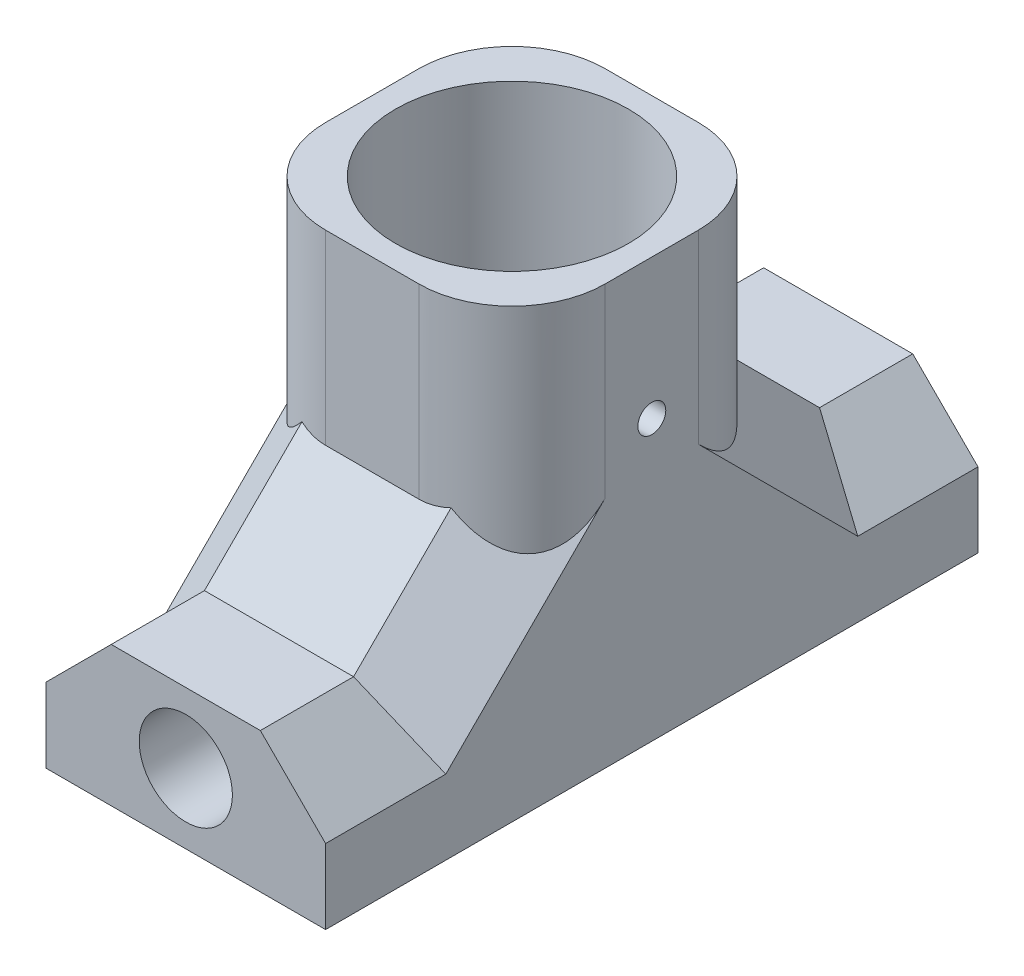
ISO-10303-21;
HEADER;
FILE_DESCRIPTION(('STEP AP214'),'2;1');
FILE_NAME('part.step','',(''),(''),'','','');
FILE_SCHEMA(('AUTOMOTIVE_DESIGN { 1 0 10303 214 1 1 1 1 }'));
ENDSEC;
DATA;
#1=APPLICATION_CONTEXT('core data for automotive mechanical design processes');
#2=APPLICATION_PROTOCOL_DEFINITION('international standard','automotive_design',2000,#1);
#3=PRODUCT_CONTEXT('',#1,'mechanical');
#4=PRODUCT('Part','Part','',(#3));
#5=PRODUCT_RELATED_PRODUCT_CATEGORY('part','',(#4));
#6=PRODUCT_DEFINITION_FORMATION('','',#4);
#7=PRODUCT_DEFINITION_CONTEXT('part definition',#1,'design');
#8=PRODUCT_DEFINITION('design','',#6,#7);
#9=PRODUCT_DEFINITION_SHAPE('','',#8);
#10=(LENGTH_UNIT() NAMED_UNIT(*) SI_UNIT(.MILLI.,.METRE.));
#11=(NAMED_UNIT(*) PLANE_ANGLE_UNIT() SI_UNIT($,.RADIAN.));
#12=(NAMED_UNIT(*) SI_UNIT($,.STERADIAN.) SOLID_ANGLE_UNIT());
#13=UNCERTAINTY_MEASURE_WITH_UNIT(LENGTH_MEASURE(1.E-05),#10,'distance_accuracy_value','');
#14=(GEOMETRIC_REPRESENTATION_CONTEXT(3) GLOBAL_UNCERTAINTY_ASSIGNED_CONTEXT((#13)) GLOBAL_UNIT_ASSIGNED_CONTEXT((#10,
#11,#12)) REPRESENTATION_CONTEXT('',''));
#15=CARTESIAN_POINT('',(0.,0.,0.));
#16=DIRECTION('',(0.,0.,1.));
#17=DIRECTION('',(1.,0.,0.));
#18=AXIS2_PLACEMENT_3D('',#15,#16,#17);
#19=CARTESIAN_POINT('',(30.,0.,0.));
#20=DIRECTION('',(0.,0.,-1.));
#21=DIRECTION('',(-1.,0.,0.));
#22=AXIS2_PLACEMENT_3D('',#19,#20,#21);
#23=PLANE('',#22);
#24=CARTESIAN_POINT('',(15.,7.5,0.));
#25=DIRECTION('',(0.,0.,1.));
#26=DIRECTION('',(1.,0.,0.));
#27=AXIS2_PLACEMENT_3D('',#24,#25,#26);
#28=CIRCLE('',#27,5.);
#29=CARTESIAN_POINT('',(20.,7.5,0.));
#30=VERTEX_POINT('',#29);
#31=EDGE_CURVE('E363',#30,#30,#28,.T.);
#32=ORIENTED_EDGE('',*,*,#31,.F.);
#33=EDGE_LOOP('',(#32));
#34=FACE_BOUND('',#33,.T.);
#35=DIRECTION('',(-1.,0.,0.));
#36=VECTOR('',#35,1.);
#37=CARTESIAN_POINT('',(30.,15.,0.));
#38=LINE('',#37,#36);
#39=CARTESIAN_POINT('',(23.,15.,0.));
#40=VERTEX_POINT('',#39);
#41=CARTESIAN_POINT('',(7.00000000000002,15.,0.));
#42=VERTEX_POINT('',#41);
#43=EDGE_CURVE('E493',#40,#42,#38,.T.);
#44=ORIENTED_EDGE('',*,*,#43,.T.);
#45=DIRECTION('',(-0.707106781186549,-0.707106781186546,0.));
#46=VECTOR('',#45,1.);
#47=CARTESIAN_POINT('',(7.00000000000002,15.,0.));
#48=LINE('',#47,#46);
#49=CARTESIAN_POINT('',(0.,8.,0.));
#50=VERTEX_POINT('',#49);
#51=EDGE_CURVE('E297',#42,#50,#48,.T.);
#52=ORIENTED_EDGE('',*,*,#51,.T.);
#53=DIRECTION('',(0.,-1.,0.));
#54=VECTOR('',#53,1.);
#55=CARTESIAN_POINT('',(0.,0.,0.));
#56=LINE('',#55,#54);
#57=CARTESIAN_POINT('',(0.,0.,0.));
#58=VERTEX_POINT('',#57);
#59=EDGE_CURVE('E211',#50,#58,#56,.T.);
#60=ORIENTED_EDGE('',*,*,#59,.T.);
#61=DIRECTION('',(-1.,0.,0.));
#62=VECTOR('',#61,1.);
#63=CARTESIAN_POINT('',(30.,0.,0.));
#64=LINE('',#63,#62);
#65=CARTESIAN_POINT('',(30.,0.,0.));
#66=VERTEX_POINT('',#65);
#67=EDGE_CURVE('E202',#66,#58,#64,.T.);
#68=ORIENTED_EDGE('',*,*,#67,.F.);
#69=DIRECTION('',(0.,-1.,0.));
#70=VECTOR('',#69,1.);
#71=CARTESIAN_POINT('',(30.,0.,0.));
#72=LINE('',#71,#70);
#73=CARTESIAN_POINT('',(30.,8.00000000000001,0.));
#74=VERTEX_POINT('',#73);
#75=EDGE_CURVE('E186',#74,#66,#72,.T.);
#76=ORIENTED_EDGE('',*,*,#75,.F.);
#77=DIRECTION('',(0.707106781186549,-0.707106781186546,0.));
#78=VECTOR('',#77,1.);
#79=CARTESIAN_POINT('',(30.,8.00000000000001,0.));
#80=LINE('',#79,#78);
#81=EDGE_CURVE('E294',#74,#40,#80,.F.);
#82=ORIENTED_EDGE('',*,*,#81,.T.);
#83=EDGE_LOOP('',(#44,#52,#60,#68,#76,#82));
#84=FACE_BOUND('',#83,.T.);
#85=ADVANCED_FACE('F39',(#34,#84),#23,.F.);
#86=CARTESIAN_POINT('',(30.,0.,0.));
#87=DIRECTION('',(0.,1.,0.));
#88=DIRECTION('',(0.,0.,1.));
#89=AXIS2_PLACEMENT_3D('',#86,#87,#88);
#90=PLANE('',#89);
#91=DIRECTION('',(0.,0.,-1.));
#92=VECTOR('',#91,1.);
#93=CARTESIAN_POINT('',(0.,0.,0.));
#94=LINE('',#93,#92);
#95=CARTESIAN_POINT('',(0.,0.,-70.));
#96=VERTEX_POINT('',#95);
#97=EDGE_CURVE('E536',#58,#96,#94,.T.);
#98=ORIENTED_EDGE('',*,*,#97,.T.);
#99=DIRECTION('',(-1.,0.,0.));
#100=VECTOR('',#99,1.);
#101=CARTESIAN_POINT('',(30.,0.,-70.));
#102=LINE('',#101,#100);
#103=CARTESIAN_POINT('',(30.,0.,-70.));
#104=VERTEX_POINT('',#103);
#105=EDGE_CURVE('E204',#104,#96,#102,.T.);
#106=ORIENTED_EDGE('',*,*,#105,.F.);
#107=DIRECTION('',(0.,0.,-1.));
#108=VECTOR('',#107,1.);
#109=CARTESIAN_POINT('',(30.,0.,0.));
#110=LINE('',#109,#108);
#111=EDGE_CURVE('E190',#66,#104,#110,.T.);
#112=ORIENTED_EDGE('',*,*,#111,.F.);
#113=ORIENTED_EDGE('',*,*,#67,.T.);
#114=EDGE_LOOP('',(#98,#106,#112,#113));
#115=FACE_BOUND('',#114,.T.);
#116=ADVANCED_FACE('F201',(#115),#90,.F.);
#117=CARTESIAN_POINT('',(30.,0.,-70.));
#118=DIRECTION('',(0.,0.,1.));
#119=DIRECTION('',(1.,0.,0.));
#120=AXIS2_PLACEMENT_3D('',#117,#118,#119);
#121=PLANE('',#120);
#122=CARTESIAN_POINT('',(15.,7.5,-70.));
#123=DIRECTION('',(0.,0.,1.));
#124=DIRECTION('',(1.,0.,0.));
#125=AXIS2_PLACEMENT_3D('',#122,#123,#124);
#126=CIRCLE('',#125,5.);
#127=CARTESIAN_POINT('',(20.,7.5,-70.));
#128=VERTEX_POINT('',#127);
#129=EDGE_CURVE('E579',#128,#128,#126,.T.);
#130=ORIENTED_EDGE('',*,*,#129,.T.);
#131=EDGE_LOOP('',(#130));
#132=FACE_BOUND('',#131,.T.);
#133=DIRECTION('',(0.,1.,0.));
#134=VECTOR('',#133,1.);
#135=CARTESIAN_POINT('',(0.,0.,-70.));
#136=LINE('',#135,#134);
#137=CARTESIAN_POINT('',(0.,7.99999999999999,-70.));
#138=VERTEX_POINT('',#137);
#139=EDGE_CURVE('E540',#96,#138,#136,.T.);
#140=ORIENTED_EDGE('',*,*,#139,.T.);
#141=DIRECTION('',(0.707106781186549,0.707106781186546,0.));
#142=VECTOR('',#141,1.);
#143=CARTESIAN_POINT('',(7.00000000000005,15.,-70.));
#144=LINE('',#143,#142);
#145=CARTESIAN_POINT('',(7.00000000000005,15.,-70.));
#146=VERTEX_POINT('',#145);
#147=EDGE_CURVE('E329',#138,#146,#144,.T.);
#148=ORIENTED_EDGE('',*,*,#147,.T.);
#149=DIRECTION('',(-1.,0.,0.));
#150=VECTOR('',#149,1.);
#151=CARTESIAN_POINT('',(30.,15.,-70.));
#152=LINE('',#151,#150);
#153=CARTESIAN_POINT('',(22.9999999999999,15.,-70.));
#154=VERTEX_POINT('',#153);
#155=EDGE_CURVE('E221',#154,#146,#152,.T.);
#156=ORIENTED_EDGE('',*,*,#155,.F.);
#157=DIRECTION('',(-0.707106781186549,0.707106781186546,0.));
#158=VECTOR('',#157,1.);
#159=CARTESIAN_POINT('',(30.,7.99999999999997,-70.));
#160=LINE('',#159,#158);
#161=CARTESIAN_POINT('',(30.,7.99999999999997,-70.));
#162=VERTEX_POINT('',#161);
#163=EDGE_CURVE('E326',#154,#162,#160,.F.);
#164=ORIENTED_EDGE('',*,*,#163,.T.);
#165=DIRECTION('',(0.,1.,0.));
#166=VECTOR('',#165,1.);
#167=CARTESIAN_POINT('',(30.,0.,-70.));
#168=LINE('',#167,#166);
#169=EDGE_CURVE('E207',#104,#162,#168,.T.);
#170=ORIENTED_EDGE('',*,*,#169,.F.);
#171=ORIENTED_EDGE('',*,*,#105,.T.);
#172=EDGE_LOOP('',(#140,#148,#156,#164,#170,#171));
#173=FACE_BOUND('',#172,.T.);
#174=ADVANCED_FACE('F409',(#132,#173),#121,.F.);
#175=CARTESIAN_POINT('',(30.,15.,-50.));
#176=DIRECTION('',(0.,-1.,0.));
#177=DIRECTION('',(0.,0.,-1.));
#178=AXIS2_PLACEMENT_3D('',#175,#176,#177);
#179=PLANE('',#178);
#180=ORIENTED_EDGE('',*,*,#155,.T.);
#181=DIRECTION('',(0.,0.,1.));
#182=VECTOR('',#181,1.);
#183=CARTESIAN_POINT('',(7.00000000000005,15.,-60.));
#184=LINE('',#183,#182);
#185=CARTESIAN_POINT('',(7.00000000000005,15.,-60.));
#186=VERTEX_POINT('',#185);
#187=EDGE_CURVE('E322',#146,#186,#184,.T.);
#188=ORIENTED_EDGE('',*,*,#187,.T.);
#189=DIRECTION('',(1.,0.,0.));
#190=VECTOR('',#189,1.);
#191=CARTESIAN_POINT('',(30.,15.,-60.));
#192=LINE('',#191,#190);
#193=CARTESIAN_POINT('',(22.9999999999999,15.,-60.));
#194=VERTEX_POINT('',#193);
#195=EDGE_CURVE('E219',#186,#194,#192,.T.);
#196=ORIENTED_EDGE('',*,*,#195,.T.);
#197=DIRECTION('',(0.,0.,-1.));
#198=VECTOR('',#197,1.);
#199=CARTESIAN_POINT('',(22.9999999999999,15.,-50.));
#200=LINE('',#199,#198);
#201=EDGE_CURVE('E319',#194,#154,#200,.T.);
#202=ORIENTED_EDGE('',*,*,#201,.T.);
#203=EDGE_LOOP('',(#180,#188,#196,#202));
#204=FACE_BOUND('',#203,.T.);
#205=ADVANCED_FACE('F506',(#204),#179,.F.);
#206=CARTESIAN_POINT('',(30.,15.,-50.));
#207=DIRECTION('',(0.,0.,1.));
#208=DIRECTION('',(0.,-1.,0.));
#209=AXIS2_PLACEMENT_3D('',#206,#207,#208);
#210=PLANE('',#209);
#211=DIRECTION('',(-1.,0.,0.));
#212=VECTOR('',#211,1.);
#213=CARTESIAN_POINT('',(0.,25.0000000000001,-50.));
#214=LINE('',#213,#212);
#215=CARTESIAN_POINT('',(20.,25.0000000000001,-50.));
#216=VERTEX_POINT('',#215);
#217=CARTESIAN_POINT('',(10.,25.0000000000001,-50.));
#218=VERTEX_POINT('',#217);
#219=EDGE_CURVE('E214',#216,#218,#214,.T.);
#220=ORIENTED_EDGE('',*,*,#219,.T.);
#221=DIRECTION('',(0.,1.,0.));
#222=VECTOR('',#221,1.);
#223=CARTESIAN_POINT('',(10.,45.,-50.));
#224=LINE('',#223,#222);
#225=CARTESIAN_POINT('',(10.,45.,-50.));
#226=VERTEX_POINT('',#225);
#227=EDGE_CURVE('E239',#218,#226,#224,.T.);
#228=ORIENTED_EDGE('',*,*,#227,.T.);
#229=DIRECTION('',(-1.,0.,0.));
#230=VECTOR('',#229,1.);
#231=CARTESIAN_POINT('',(30.,45.,-50.));
#232=LINE('',#231,#230);
#233=CARTESIAN_POINT('',(20.,45.,-50.));
#234=VERTEX_POINT('',#233);
#235=EDGE_CURVE('E492',#234,#226,#232,.T.);
#236=ORIENTED_EDGE('',*,*,#235,.F.);
#237=DIRECTION('',(0.,1.,0.));
#238=VECTOR('',#237,1.);
#239=CARTESIAN_POINT('',(20.,15.,-50.));
#240=LINE('',#239,#238);
#241=EDGE_CURVE('E236',#234,#216,#240,.F.);
#242=ORIENTED_EDGE('',*,*,#241,.T.);
#243=EDGE_LOOP('',(#220,#228,#236,#242));
#244=FACE_BOUND('',#243,.T.);
#245=ADVANCED_FACE('F522',(#244),#210,.F.);
#246=CARTESIAN_POINT('',(30.,45.,-20.));
#247=DIRECTION('',(0.,-1.,0.));
#248=DIRECTION('',(0.,0.,-1.));
#249=AXIS2_PLACEMENT_3D('',#246,#247,#248);
#250=PLANE('',#249);
#251=CARTESIAN_POINT('',(15.,45.,-35.));
#252=DIRECTION('',(0.,1.,0.));
#253=DIRECTION('',(0.,0.,1.));
#254=AXIS2_PLACEMENT_3D('',#251,#252,#253);
#255=CIRCLE('',#254,12.5);
#256=CARTESIAN_POINT('',(15.,45.,-22.5));
#257=VERTEX_POINT('',#256);
#258=EDGE_CURVE('E581',#257,#257,#255,.T.);
#259=ORIENTED_EDGE('',*,*,#258,.F.);
#260=EDGE_LOOP('',(#259));
#261=FACE_BOUND('',#260,.T.);
#262=ORIENTED_EDGE('',*,*,#235,.T.);
#263=CARTESIAN_POINT('',(10.,45.,-40.));
#264=DIRECTION('',(0.,-1.,0.));
#265=DIRECTION('',(0.,0.,-1.));
#266=AXIS2_PLACEMENT_3D('',#263,#264,#265);
#267=CIRCLE('',#266,10.);
#268=CARTESIAN_POINT('',(0.,45.,-40.));
#269=VERTEX_POINT('',#268);
#270=EDGE_CURVE('E252',#226,#269,#267,.F.);
#271=ORIENTED_EDGE('',*,*,#270,.T.);
#272=DIRECTION('',(0.,0.,1.));
#273=VECTOR('',#272,1.);
#274=CARTESIAN_POINT('',(0.,45.,-20.));
#275=LINE('',#274,#273);
#276=CARTESIAN_POINT('',(0.,45.,-30.));
#277=VERTEX_POINT('',#276);
#278=EDGE_CURVE('E197',#269,#277,#275,.T.);
#279=ORIENTED_EDGE('',*,*,#278,.T.);
#280=CARTESIAN_POINT('',(10.,45.,-30.));
#281=DIRECTION('',(0.,-1.,0.));
#282=DIRECTION('',(0.,0.,-1.));
#283=AXIS2_PLACEMENT_3D('',#280,#281,#282);
#284=CIRCLE('',#283,10.);
#285=CARTESIAN_POINT('',(10.,45.,-20.));
#286=VERTEX_POINT('',#285);
#287=EDGE_CURVE('E246',#277,#286,#284,.F.);
#288=ORIENTED_EDGE('',*,*,#287,.T.);
#289=DIRECTION('',(-1.,0.,0.));
#290=VECTOR('',#289,1.);
#291=CARTESIAN_POINT('',(30.,45.,-20.));
#292=LINE('',#291,#290);
#293=CARTESIAN_POINT('',(20.,45.,-20.));
#294=VERTEX_POINT('',#293);
#295=EDGE_CURVE('E482',#294,#286,#292,.T.);
#296=ORIENTED_EDGE('',*,*,#295,.F.);
#297=CARTESIAN_POINT('',(20.,45.,-30.));
#298=DIRECTION('',(0.,-1.,0.));
#299=DIRECTION('',(0.,0.,-1.));
#300=AXIS2_PLACEMENT_3D('',#297,#298,#299);
#301=CIRCLE('',#300,10.);
#302=CARTESIAN_POINT('',(30.,45.,-30.));
#303=VERTEX_POINT('',#302);
#304=EDGE_CURVE('E243',#294,#303,#301,.F.);
#305=ORIENTED_EDGE('',*,*,#304,.T.);
#306=DIRECTION('',(0.,0.,1.));
#307=VECTOR('',#306,1.);
#308=CARTESIAN_POINT('',(30.,45.,-20.));
#309=LINE('',#308,#307);
#310=CARTESIAN_POINT('',(30.,45.,-40.));
#311=VERTEX_POINT('',#310);
#312=EDGE_CURVE('E498',#311,#303,#309,.T.);
#313=ORIENTED_EDGE('',*,*,#312,.F.);
#314=CARTESIAN_POINT('',(20.,45.,-40.));
#315=DIRECTION('',(0.,-1.,0.));
#316=DIRECTION('',(0.,0.,-1.));
#317=AXIS2_PLACEMENT_3D('',#314,#315,#316);
#318=CIRCLE('',#317,10.);
#319=EDGE_CURVE('E249',#311,#234,#318,.F.);
#320=ORIENTED_EDGE('',*,*,#319,.T.);
#321=EDGE_LOOP('',(#262,#271,#279,#288,#296,#305,#313,#320));
#322=FACE_BOUND('',#321,.T.);
#323=ADVANCED_FACE('F486',(#261,#322),#250,.F.);
#324=CARTESIAN_POINT('',(30.,15.,-20.));
#325=DIRECTION('',(0.,0.,-1.));
#326=DIRECTION('',(-1.,0.,0.));
#327=AXIS2_PLACEMENT_3D('',#324,#325,#326);
#328=PLANE('',#327);
#329=ORIENTED_EDGE('',*,*,#295,.T.);
#330=DIRECTION('',(0.,-1.,0.));
#331=VECTOR('',#330,1.);
#332=CARTESIAN_POINT('',(10.,25.,-20.));
#333=LINE('',#332,#331);
#334=CARTESIAN_POINT('',(10.,25.,-20.));
#335=VERTEX_POINT('',#334);
#336=EDGE_CURVE('E269',#286,#335,#333,.T.);
#337=ORIENTED_EDGE('',*,*,#336,.T.);
#338=DIRECTION('',(1.,0.,0.));
#339=VECTOR('',#338,1.);
#340=CARTESIAN_POINT('',(30.,25.,-20.));
#341=LINE('',#340,#339);
#342=CARTESIAN_POINT('',(20.,25.,-20.));
#343=VERTEX_POINT('',#342);
#344=EDGE_CURVE('E232',#335,#343,#341,.T.);
#345=ORIENTED_EDGE('',*,*,#344,.T.);
#346=DIRECTION('',(0.,-1.,0.));
#347=VECTOR('',#346,1.);
#348=CARTESIAN_POINT('',(20.,15.,-20.));
#349=LINE('',#348,#347);
#350=EDGE_CURVE('E266',#343,#294,#349,.F.);
#351=ORIENTED_EDGE('',*,*,#350,.T.);
#352=EDGE_LOOP('',(#329,#337,#345,#351));
#353=FACE_BOUND('',#352,.T.);
#354=ADVANCED_FACE('F481',(#353),#328,.F.);
#355=CARTESIAN_POINT('',(30.,15.,0.));
#356=DIRECTION('',(0.,-1.,0.));
#357=DIRECTION('',(0.,0.,-1.));
#358=AXIS2_PLACEMENT_3D('',#355,#356,#357);
#359=PLANE('',#358);
#360=DIRECTION('',(-1.,0.,0.));
#361=VECTOR('',#360,1.);
#362=CARTESIAN_POINT('',(0.,15.,-9.99999999999993));
#363=LINE('',#362,#361);
#364=CARTESIAN_POINT('',(23.,15.,-9.99999999999993));
#365=VERTEX_POINT('',#364);
#366=CARTESIAN_POINT('',(7.00000000000002,15.,-9.99999999999993));
#367=VERTEX_POINT('',#366);
#368=EDGE_CURVE('E228',#365,#367,#363,.T.);
#369=ORIENTED_EDGE('',*,*,#368,.T.);
#370=DIRECTION('',(0.,0.,1.));
#371=VECTOR('',#370,1.);
#372=CARTESIAN_POINT('',(7.00000000000002,15.,0.));
#373=LINE('',#372,#371);
#374=EDGE_CURVE('E290',#367,#42,#373,.T.);
#375=ORIENTED_EDGE('',*,*,#374,.T.);
#376=ORIENTED_EDGE('',*,*,#43,.F.);
#377=DIRECTION('',(0.,0.,-1.));
#378=VECTOR('',#377,1.);
#379=CARTESIAN_POINT('',(23.,15.,0.));
#380=LINE('',#379,#378);
#381=EDGE_CURVE('E287',#40,#365,#380,.T.);
#382=ORIENTED_EDGE('',*,*,#381,.T.);
#383=EDGE_LOOP('',(#369,#375,#376,#382));
#384=FACE_BOUND('',#383,.T.);
#385=ADVANCED_FACE('F552',(#384),#359,.F.);
#386=CARTESIAN_POINT('',(30.,0.,0.));
#387=DIRECTION('',(-1.,0.,0.));
#388=DIRECTION('',(0.,0.,1.));
#389=AXIS2_PLACEMENT_3D('',#386,#387,#388);
#390=PLANE('',#389);
#391=CARTESIAN_POINT('',(30.,30.,-35.));
#392=DIRECTION('',(1.,0.,0.));
#393=DIRECTION('',(0.,0.,-1.));
#394=AXIS2_PLACEMENT_3D('',#391,#392,#393);
#395=CIRCLE('',#394,1.5);
#396=CARTESIAN_POINT('',(30.,30.,-36.5));
#397=VERTEX_POINT('',#396);
#398=EDGE_CURVE('E590',#397,#397,#395,.T.);
#399=ORIENTED_EDGE('',*,*,#398,.F.);
#400=EDGE_LOOP('',(#399));
#401=FACE_BOUND('',#400,.T.);
#402=ORIENTED_EDGE('',*,*,#169,.T.);
#403=DIRECTION('',(0.,0.,1.));
#404=VECTOR('',#403,1.);
#405=CARTESIAN_POINT('',(30.,7.99999999999997,0.));
#406=LINE('',#405,#404);
#407=CARTESIAN_POINT('',(30.,7.99999999999997,-57.1005050633882));
#408=VERTEX_POINT('',#407);
#409=EDGE_CURVE('E346',#162,#408,#406,.T.);
#410=ORIENTED_EDGE('',*,*,#409,.T.);
#411=DIRECTION('',(0.,0.707106781186551,0.707106781186544));
#412=VECTOR('',#411,1.);
#413=CARTESIAN_POINT('',(30.,32.5502525316941,-32.5502525316944));
#414=LINE('',#413,#412);
#415=CARTESIAN_POINT('',(30.,25.1005050633884,-40.));
#416=VERTEX_POINT('',#415);
#417=EDGE_CURVE('E343',#408,#416,#414,.T.);
#418=ORIENTED_EDGE('',*,*,#417,.T.);
#419=DIRECTION('',(0.,1.,0.));
#420=VECTOR('',#419,1.);
#421=CARTESIAN_POINT('',(30.,0.,-40.));
#422=LINE('',#421,#420);
#423=EDGE_CURVE('E70',#416,#311,#422,.T.);
#424=ORIENTED_EDGE('',*,*,#423,.T.);
#425=ORIENTED_EDGE('',*,*,#312,.T.);
#426=DIRECTION('',(0.,-1.,0.));
#427=VECTOR('',#426,1.);
#428=CARTESIAN_POINT('',(30.,0.,-30.));
#429=LINE('',#428,#427);
#430=CARTESIAN_POINT('',(30.,25.1005050633883,-30.));
#431=VERTEX_POINT('',#430);
#432=EDGE_CURVE('E261',#303,#431,#429,.T.);
#433=ORIENTED_EDGE('',*,*,#432,.T.);
#434=DIRECTION('',(0.,-0.707106781186544,0.707106781186551));
#435=VECTOR('',#434,1.);
#436=CARTESIAN_POINT('',(30.,-2.44974746830574,-2.44974746830572));
#437=LINE('',#436,#435);
#438=CARTESIAN_POINT('',(30.,8.00000000000001,-12.8994949366116));
#439=VERTEX_POINT('',#438);
#440=EDGE_CURVE('E338',#431,#439,#437,.T.);
#441=ORIENTED_EDGE('',*,*,#440,.T.);
#442=DIRECTION('',(0.,0.,1.));
#443=VECTOR('',#442,1.);
#444=CARTESIAN_POINT('',(30.,8.00000000000001,0.));
#445=LINE('',#444,#443);
#446=EDGE_CURVE('E193',#439,#74,#445,.T.);
#447=ORIENTED_EDGE('',*,*,#446,.T.);
#448=ORIENTED_EDGE('',*,*,#75,.T.);
#449=ORIENTED_EDGE('',*,*,#111,.T.);
#450=EDGE_LOOP('',(#402,#410,#418,#424,#425,#433,#441,#447,#448,#449));
#451=FACE_BOUND('',#450,.T.);
#452=ADVANCED_FACE('F189',(#401,#451),#390,.F.);
#453=CARTESIAN_POINT('',(0.,0.,0.));
#454=DIRECTION('',(-1.,0.,0.));
#455=DIRECTION('',(0.,0.,1.));
#456=AXIS2_PLACEMENT_3D('',#453,#454,#455);
#457=PLANE('',#456);
#458=CARTESIAN_POINT('',(0.,30.,-35.));
#459=DIRECTION('',(1.,0.,0.));
#460=DIRECTION('',(0.,0.,-1.));
#461=AXIS2_PLACEMENT_3D('',#458,#459,#460);
#462=CIRCLE('',#461,1.5);
#463=CARTESIAN_POINT('',(0.,30.,-36.5));
#464=VERTEX_POINT('',#463);
#465=EDGE_CURVE('E378',#464,#464,#462,.T.);
#466=ORIENTED_EDGE('',*,*,#465,.T.);
#467=EDGE_LOOP('',(#466));
#468=FACE_BOUND('',#467,.T.);
#469=ORIENTED_EDGE('',*,*,#59,.F.);
#470=DIRECTION('',(0.,0.,-1.));
#471=VECTOR('',#470,1.);
#472=CARTESIAN_POINT('',(0.,8.,-9.99999999999993));
#473=LINE('',#472,#471);
#474=CARTESIAN_POINT('',(0.,8.,-12.8994949366116));
#475=VERTEX_POINT('',#474);
#476=EDGE_CURVE('E310',#50,#475,#473,.T.);
#477=ORIENTED_EDGE('',*,*,#476,.T.);
#478=DIRECTION('',(0.,0.707106781186544,-0.707106781186551));
#479=VECTOR('',#478,1.);
#480=CARTESIAN_POINT('',(0.,30.050252531694,-34.9497474683058));
#481=LINE('',#480,#479);
#482=CARTESIAN_POINT('',(0.,25.1005050633883,-30.));
#483=VERTEX_POINT('',#482);
#484=EDGE_CURVE('E306',#475,#483,#481,.T.);
#485=ORIENTED_EDGE('',*,*,#484,.T.);
#486=DIRECTION('',(0.,-1.,0.));
#487=VECTOR('',#486,1.);
#488=CARTESIAN_POINT('',(0.,45.,-30.));
#489=LINE('',#488,#487);
#490=EDGE_CURVE('E255',#483,#277,#489,.F.);
#491=ORIENTED_EDGE('',*,*,#490,.T.);
#492=ORIENTED_EDGE('',*,*,#278,.F.);
#493=DIRECTION('',(0.,1.,0.));
#494=VECTOR('',#493,1.);
#495=CARTESIAN_POINT('',(0.,25.0000000000001,-40.));
#496=LINE('',#495,#494);
#497=CARTESIAN_POINT('',(0.,25.1005050633884,-40.));
#498=VERTEX_POINT('',#497);
#499=EDGE_CURVE('E258',#269,#498,#496,.F.);
#500=ORIENTED_EDGE('',*,*,#499,.T.);
#501=DIRECTION('',(0.,-0.707106781186551,-0.707106781186544));
#502=VECTOR('',#501,1.);
#503=CARTESIAN_POINT('',(0.,10.0502525316942,-55.0502525316941));
#504=LINE('',#503,#502);
#505=CARTESIAN_POINT('',(0.,7.99999999999999,-57.1005050633882));
#506=VERTEX_POINT('',#505);
#507=EDGE_CURVE('E300',#498,#506,#504,.T.);
#508=ORIENTED_EDGE('',*,*,#507,.T.);
#509=DIRECTION('',(0.,0.,-1.));
#510=VECTOR('',#509,1.);
#511=CARTESIAN_POINT('',(0.,7.99999999999999,-70.));
#512=LINE('',#511,#510);
#513=EDGE_CURVE('E303',#506,#138,#512,.T.);
#514=ORIENTED_EDGE('',*,*,#513,.T.);
#515=ORIENTED_EDGE('',*,*,#139,.F.);
#516=ORIENTED_EDGE('',*,*,#97,.F.);
#517=EDGE_LOOP('',(#469,#477,#485,#491,#492,#500,#508,#514,#515,#516));
#518=FACE_BOUND('',#517,.T.);
#519=ADVANCED_FACE('F400',(#468,#518),#457,.T.);
#520=CARTESIAN_POINT('',(15.,15.,-35.));
#521=DIRECTION('',(0.,1.,0.));
#522=DIRECTION('',(0.,0.,1.));
#523=AXIS2_PLACEMENT_3D('',#520,#521,#522);
#524=CYLINDRICAL_SURFACE('',#523,12.5);
#525=CARTESIAN_POINT('',(2.59032635400914,30.,-36.5));
#526=CARTESIAN_POINT('',(2.59032519108325,29.9160704294048,-36.4999964158639));
#527=CARTESIAN_POINT('',(2.58946571057862,29.8320877399393,-36.4929320674817));
#528=CARTESIAN_POINT('',(2.58612177447835,29.6664576939842,-36.4648615935482));
#529=CARTESIAN_POINT('',(2.58363560070165,29.5848129021595,-36.4438407261951));
#530=CARTESIAN_POINT('',(2.57732384473806,29.4262807972431,-36.3884841730792));
#531=CARTESIAN_POINT('',(2.57349915063201,29.3493903694319,-36.3541573139487));
#532=CARTESIAN_POINT('',(2.5649423750156,29.2024764289495,-36.2731816877897));
#533=CARTESIAN_POINT('',(2.5602104541034,29.132451704216,-36.2265351010601));
#534=CARTESIAN_POINT('',(2.5503449972676,29.0008801141949,-36.1219857196502));
#535=CARTESIAN_POINT('',(2.54520970917461,28.9393738528257,-36.0640319862532));
#536=CARTESIAN_POINT('',(2.53513192072713,28.826935640919,-35.9386229321744));
#537=CARTESIAN_POINT('',(2.53018942980158,28.7760042070291,-35.871167147527));
#538=CARTESIAN_POINT('',(2.52103629884692,28.6860167335319,-35.728414784234));
#539=CARTESIAN_POINT('',(2.51682793096672,28.6469972921302,-35.6530949769245));
#540=CARTESIAN_POINT('',(2.50963643783793,28.5821757698076,-35.4969128836364));
#541=CARTESIAN_POINT('',(2.50665327052665,28.5563732351261,-35.4160507880428));
#542=CARTESIAN_POINT('',(2.50226063377372,28.5188388719483,-35.2514939284925));
#543=CARTESIAN_POINT('',(2.50084363177961,28.5070396732771,-35.1678147355217));
#544=CARTESIAN_POINT('',(2.49971728169491,28.4976382003447,-34.9996527516657));
#545=CARTESIAN_POINT('',(2.50000787139827,28.5000354089209,-34.9151699901658));
#546=CARTESIAN_POINT('',(2.50225785373669,28.5189045609257,-34.7482571662412));
#547=CARTESIAN_POINT('',(2.50420865578309,28.5353040524862,-34.6658187812159));
#548=CARTESIAN_POINT('',(2.50955017888096,28.581599075858,-34.5048728149544));
#549=CARTESIAN_POINT('',(2.51294092547671,28.6114948470908,-34.4263653034787));
#550=CARTESIAN_POINT('',(2.52079610477232,28.6840113644533,-34.2752844383703));
#551=CARTESIAN_POINT('',(2.52526319056539,28.7266636180032,-34.2027263513623));
#552=CARTESIAN_POINT('',(2.53477095164195,28.8234594494781,-34.0657705399006));
#553=CARTESIAN_POINT('',(2.53981165117021,28.8776035132078,-34.0013731606165));
#554=CARTESIAN_POINT('',(2.5499396627352,28.9962521747702,-33.8821413943847));
#555=CARTESIAN_POINT('',(2.55502706837289,29.0608198906867,-33.8273698056081));
#556=CARTESIAN_POINT('',(2.56464369769627,29.1982657568398,-33.7294320408742));
#557=CARTESIAN_POINT('',(2.56917291987025,29.2711439295822,-33.6862658963474));
#558=CARTESIAN_POINT('',(2.57716039723923,29.4231962450737,-33.6127616082067));
#559=CARTESIAN_POINT('',(2.58061825327167,29.502372720629,-33.5824282442118));
#560=CARTESIAN_POINT('',(2.58606358466942,29.6647461797506,-33.5355049498381));
#561=CARTESIAN_POINT('',(2.58805112516342,29.7479429850597,-33.5189144107072));
#562=CARTESIAN_POINT('',(2.59031899921815,29.9154415481883,-33.5000303564392));
#563=CARTESIAN_POINT('',(2.5906098719683,29.9997332179406,-33.4976485786461));
#564=CARTESIAN_POINT('',(2.5894793349427,30.1675143904215,-33.507017009722));
#565=CARTESIAN_POINT('',(2.58805795873497,30.2510039088437,-33.5187669415437));
#566=CARTESIAN_POINT('',(2.58367268625107,30.414547891799,-33.5559910402899));
#567=CARTESIAN_POINT('',(2.58071356989208,30.4946121734047,-33.5814226875053));
#568=CARTESIAN_POINT('',(2.57359010733758,30.649339641488,-33.6452446160369));
#569=CARTESIAN_POINT('',(2.5694257219543,30.7240026522515,-33.6836353187069));
#570=CARTESIAN_POINT('',(2.56033563433505,30.8662081474873,-33.7725034863919));
#571=CARTESIAN_POINT('',(2.55540631950722,30.9337141434407,-33.8230389642926));
#572=CARTESIAN_POINT('',(2.54535322298155,31.0593175565059,-33.9346799108164));
#573=CARTESIAN_POINT('',(2.54022943432808,31.1174146367029,-33.9957857577819));
#574=CARTESIAN_POINT('',(2.53033245275448,31.2228598736175,-34.1272178636661));
#575=CARTESIAN_POINT('',(2.52556123719847,31.2701501232557,-34.1975907502911));
#576=CARTESIAN_POINT('',(2.51693637844199,31.3522391046646,-34.3453317852947));
#577=CARTESIAN_POINT('',(2.51308271799812,31.3870380711872,-34.4226998021778));
#578=CARTESIAN_POINT('',(2.50673597847429,31.4430605024379,-34.58204037764));
#579=CARTESIAN_POINT('',(2.50423951486858,31.4643177599421,-34.6640009146764));
#580=CARTESIAN_POINT('',(2.50087443177464,31.4927633717911,-34.8303597075043));
#581=CARTESIAN_POINT('',(2.50000574492171,31.4999523083466,-34.9147578622693));
#582=CARTESIAN_POINT('',(2.49999434756764,31.5000469220562,-35.0830300031278));
#583=CARTESIAN_POINT('',(2.50084083173755,31.4930420183416,-35.1669039523294));
#584=CARTESIAN_POINT('',(2.50414322989645,31.4651367725488,-35.3322736123981));
#585=CARTESIAN_POINT('',(2.50659914335787,31.4442364350252,-35.4137693240447));
#586=CARTESIAN_POINT('',(2.51284559902552,31.3891609924342,-35.5720597779918));
#587=CARTESIAN_POINT('',(2.51663574604251,31.3549898177728,-35.648855904374));
#588=CARTESIAN_POINT('',(2.52513037784195,31.2743519652078,-35.7956377052626));
#589=CARTESIAN_POINT('',(2.52983487002391,31.2278851877986,-35.8656233246468));
#590=CARTESIAN_POINT('',(2.53966803188683,31.1236431589969,-35.9972547421243));
#591=CARTESIAN_POINT('',(2.54479909119542,31.0658013223371,-36.0588476339384));
#592=CARTESIAN_POINT('',(2.55488765677045,30.9405884814238,-36.171488653562));
#593=CARTESIAN_POINT('',(2.55984512153777,30.8732152177493,-36.2225342740654));
#594=CARTESIAN_POINT('',(2.56904403962361,30.7305785319147,-36.3127853736437));
#595=CARTESIAN_POINT('',(2.57328287717954,30.6552878358635,-36.3519479910015));
#596=CARTESIAN_POINT('',(2.58053388116301,30.4991911231246,-36.4170190291187));
#597=CARTESIAN_POINT('',(2.58354739180188,30.4183912644011,-36.4429419821301));
#598=CARTESIAN_POINT('',(2.58726863815059,30.2809702304473,-36.4745350503682));
#599=CARTESIAN_POINT('',(2.58840963450246,30.22521862402,-36.4840708247097));
#600=CARTESIAN_POINT('',(2.58993888134724,30.1129860339329,-36.4968044845475));
#601=CARTESIAN_POINT('',(2.59032713694168,30.0565050552187,-36.5000024129971));
#602=CARTESIAN_POINT('',(2.59032635400914,30.,-36.5));
#603=B_SPLINE_CURVE_WITH_KNOTS('',3,(#525,#526,#527,#528,#529,#530,#531,#532,#533,#534,#535,
#536,#537,#538,#539,#540,#541,#542,#543,#544,#545,#546,#547,#548,#549,#550,#551,#552,#553,#554,
#555,#556,#557,#558,#559,#560,#561,#562,#563,#564,#565,#566,#567,#568,#569,#570,#571,#572,#573,
#574,#575,#576,#577,#578,#579,#580,#581,#582,#583,#584,#585,#586,#587,#588,#589,#590,#591,#592,
#593,#594,#595,#596,#597,#598,#599,#600,#601,#602),.UNSPECIFIED.,.T.,.F.,(4,2,2,2,2,2,2,2,2,2,2,
2,2,2,2,2,2,2,2,2,2,2,2,2,2,2,2,2,2,2,2,2,2,2,2,2,2,2,4),(0.,0.25158230660961,0.503430774819315,
0.755112462522265,1.0067496383611,1.25954776660378,1.51235824273611,1.7659378087677,
2.01950866836448,2.27185458608053,2.52419131111312,2.77523023079345,3.02627360403337,
3.27794222677636,3.52962149067919,3.78288622204423,4.0361516393056,4.28951130338296,
4.54285974404083,4.7946327704315,5.04640086098251,5.29739099483106,5.54838929022029,
5.8006112515531,6.0528422424647,6.30639464647641,6.55994228515921,6.81285470170489,
7.0657566513693,7.31707030939079,7.5683838850344,7.819623086165,8.07086432058378,
8.32362252061907,8.57644073759115,8.83016031080825,9.08360079205966,9.25297814464875,
9.42235434931911),.UNSPECIFIED.);
#604=CARTESIAN_POINT('',(2.59032635400914,30.,-36.5));
#605=VERTEX_POINT('',#604);
#606=EDGE_CURVE('E43',#605,#605,#603,.T.);
#607=ORIENTED_EDGE('',*,*,#606,.T.);
#608=EDGE_LOOP('',(#607));
#609=FACE_BOUND('',#608,.T.);
#610=CARTESIAN_POINT('',(27.4096736459909,30.,-36.5));
#611=CARTESIAN_POINT('',(27.4096748089168,30.0839295705952,-36.4999964158639));
#612=CARTESIAN_POINT('',(27.4105342894214,30.1679122600607,-36.4929320674817));
#613=CARTESIAN_POINT('',(27.4138782255216,30.3335423060158,-36.4648615935482));
#614=CARTESIAN_POINT('',(27.4163643992983,30.4151870978405,-36.4438407261951));
#615=CARTESIAN_POINT('',(27.4226761552619,30.5737192027569,-36.3884841730792));
#616=CARTESIAN_POINT('',(27.426500849368,30.6506096305681,-36.3541573139487));
#617=CARTESIAN_POINT('',(27.4350576249844,30.7975235710505,-36.2731816877897));
#618=CARTESIAN_POINT('',(27.4397895458966,30.867548295784,-36.2265351010601));
#619=CARTESIAN_POINT('',(27.4496550027324,30.9991198858051,-36.1219857196502));
#620=CARTESIAN_POINT('',(27.4547902908254,31.0606261471743,-36.0640319862532));
#621=CARTESIAN_POINT('',(27.4648680792729,31.173064359081,-35.9386229321744));
#622=CARTESIAN_POINT('',(27.4698105701984,31.2239957929709,-35.871167147527));
#623=CARTESIAN_POINT('',(27.4789637011531,31.3139832664681,-35.728414784234));
#624=CARTESIAN_POINT('',(27.4831720690333,31.3530027078698,-35.6530949769245));
#625=CARTESIAN_POINT('',(27.4903635621621,31.4178242301924,-35.4969128836364));
#626=CARTESIAN_POINT('',(27.4933467294733,31.4436267648739,-35.4160507880428));
#627=CARTESIAN_POINT('',(27.4977393662263,31.4811611280517,-35.2514939284925));
#628=CARTESIAN_POINT('',(27.4991563682204,31.4929603267229,-35.1678147355217));
#629=CARTESIAN_POINT('',(27.5002827183051,31.5023617996553,-34.9996527516657));
#630=CARTESIAN_POINT('',(27.4999921286017,31.4999645910791,-34.9151699901658));
#631=CARTESIAN_POINT('',(27.4977421462633,31.4810954390743,-34.7482571662412));
#632=CARTESIAN_POINT('',(27.4957913442169,31.4646959475138,-34.6658187812159));
#633=CARTESIAN_POINT('',(27.490449821119,31.418400924142,-34.5048728149544));
#634=CARTESIAN_POINT('',(27.4870590745233,31.3885051529092,-34.4263653034787));
#635=CARTESIAN_POINT('',(27.4792038952277,31.3159886355467,-34.2752844383703));
#636=CARTESIAN_POINT('',(27.4747368094346,31.2733363819968,-34.2027263513623));
#637=CARTESIAN_POINT('',(27.4652290483581,31.1765405505219,-34.0657705399006));
#638=CARTESIAN_POINT('',(27.4601883488298,31.1223964867922,-34.0013731606165));
#639=CARTESIAN_POINT('',(27.4500603372648,31.0037478252298,-33.8821413943847));
#640=CARTESIAN_POINT('',(27.4449729316271,30.9391801093133,-33.8273698056081));
#641=CARTESIAN_POINT('',(27.4353563023037,30.8017342431602,-33.7294320408742));
#642=CARTESIAN_POINT('',(27.4308270801298,30.7288560704178,-33.6862658963474));
#643=CARTESIAN_POINT('',(27.4228396027608,30.5768037549263,-33.6127616082067));
#644=CARTESIAN_POINT('',(27.4193817467283,30.497627279371,-33.5824282442118));
#645=CARTESIAN_POINT('',(27.4139364153306,30.3352538202494,-33.5355049498381));
#646=CARTESIAN_POINT('',(27.4119488748366,30.2520570149403,-33.5189144107072));
#647=CARTESIAN_POINT('',(27.4096810007818,30.0845584518117,-33.5000303564392));
#648=CARTESIAN_POINT('',(27.4093901280317,30.0002667820594,-33.4976485786461));
#649=CARTESIAN_POINT('',(27.4105206650573,29.8324856095785,-33.507017009722));
#650=CARTESIAN_POINT('',(27.411942041265,29.7489960911563,-33.5187669415437));
#651=CARTESIAN_POINT('',(27.4163273137489,29.585452108201,-33.5559910402899));
#652=CARTESIAN_POINT('',(27.4192864301079,29.5053878265953,-33.5814226875053));
#653=CARTESIAN_POINT('',(27.4264098926624,29.350660358512,-33.6452446160369));
#654=CARTESIAN_POINT('',(27.4305742780457,29.2759973477485,-33.6836353187069));
#655=CARTESIAN_POINT('',(27.439664365665,29.1337918525127,-33.7725034863919));
#656=CARTESIAN_POINT('',(27.4445936804928,29.0662858565593,-33.8230389642926));
#657=CARTESIAN_POINT('',(27.4546467770184,28.9406824434941,-33.9346799108164));
#658=CARTESIAN_POINT('',(27.4597705656719,28.882585363297,-33.9957857577819));
#659=CARTESIAN_POINT('',(27.4696675472455,28.7771401263825,-34.1272178636661));
#660=CARTESIAN_POINT('',(27.4744387628015,28.7298498767443,-34.1975907502911));
#661=CARTESIAN_POINT('',(27.483063621558,28.6477608953354,-34.3453317852947));
#662=CARTESIAN_POINT('',(27.4869172820019,28.6129619288128,-34.4226998021778));
#663=CARTESIAN_POINT('',(27.4932640215257,28.5569394975621,-34.58204037764));
#664=CARTESIAN_POINT('',(27.4957604851314,28.5356822400579,-34.6640009146764));
#665=CARTESIAN_POINT('',(27.4991255682254,28.5072366282089,-34.8303597075043));
#666=CARTESIAN_POINT('',(27.4999942550783,28.5000476916534,-34.9147578622693));
#667=CARTESIAN_POINT('',(27.5000056524324,28.4999530779438,-35.0830300031278));
#668=CARTESIAN_POINT('',(27.4991591682624,28.5069579816584,-35.1669039523294));
#669=CARTESIAN_POINT('',(27.4958567701036,28.5348632274512,-35.3322736123981));
#670=CARTESIAN_POINT('',(27.4934008566421,28.5557635649748,-35.4137693240447));
#671=CARTESIAN_POINT('',(27.4871544009745,28.6108390075658,-35.5720597779918));
#672=CARTESIAN_POINT('',(27.4833642539575,28.6450101822272,-35.648855904374));
#673=CARTESIAN_POINT('',(27.474869622158,28.7256480347922,-35.7956377052626));
#674=CARTESIAN_POINT('',(27.4701651299761,28.7721148122014,-35.8656233246468));
#675=CARTESIAN_POINT('',(27.4603319681132,28.8763568410031,-35.9972547421243));
#676=CARTESIAN_POINT('',(27.4552009088046,28.9341986776629,-36.0588476339384));
#677=CARTESIAN_POINT('',(27.4451123432295,29.0594115185762,-36.171488653562));
#678=CARTESIAN_POINT('',(27.4401548784622,29.1267847822507,-36.2225342740654));
#679=CARTESIAN_POINT('',(27.4309559603764,29.2694214680852,-36.3127853736437));
#680=CARTESIAN_POINT('',(27.4267171228205,29.3447121641365,-36.3519479910015));
#681=CARTESIAN_POINT('',(27.419466118837,29.5008088768754,-36.4170190291187));
#682=CARTESIAN_POINT('',(27.4164526081981,29.5816087355989,-36.4429419821301));
#683=CARTESIAN_POINT('',(27.4127313618494,29.7190297695527,-36.4745350503682));
#684=CARTESIAN_POINT('',(27.4115903654975,29.7747813759799,-36.4840708247097));
#685=CARTESIAN_POINT('',(27.4100611186528,29.8870139660671,-36.4968044845475));
#686=CARTESIAN_POINT('',(27.4096728630583,29.9434949447813,-36.5000024129971));
#687=CARTESIAN_POINT('',(27.4096736459909,30.,-36.5));
#688=B_SPLINE_CURVE_WITH_KNOTS('',3,(#610,#611,#612,#613,#614,#615,#616,#617,#618,#619,#620,
#621,#622,#623,#624,#625,#626,#627,#628,#629,#630,#631,#632,#633,#634,#635,#636,#637,#638,#639,
#640,#641,#642,#643,#644,#645,#646,#647,#648,#649,#650,#651,#652,#653,#654,#655,#656,#657,#658,
#659,#660,#661,#662,#663,#664,#665,#666,#667,#668,#669,#670,#671,#672,#673,#674,#675,#676,#677,
#678,#679,#680,#681,#682,#683,#684,#685,#686,#687),.UNSPECIFIED.,.T.,.F.,(4,2,2,2,2,2,2,2,2,2,2,
2,2,2,2,2,2,2,2,2,2,2,2,2,2,2,2,2,2,2,2,2,2,2,2,2,2,2,4),(0.,0.251582306609613,
0.503430774819316,0.755112462522265,1.0067496383611,1.25954776660378,1.51235824273612,
1.7659378087677,2.01950866836448,2.27185458608053,2.52419131111312,2.77523023079345,
3.02627360403337,3.27794222677637,3.5296214906792,3.78288622204423,4.0361516393056,
4.28951130338296,4.54285974404083,4.7946327704315,5.04640086098251,5.29739099483106,
5.54838929022029,5.80061125155311,6.0528422424647,6.30639464647642,6.5599422851592,
6.8128547017049,7.0657566513693,7.31707030939079,7.56838388503439,7.819623086165,
8.07086432058378,8.32362252061908,8.57644073759114,8.83016031080825,9.08360079205966,
9.25297814464875,9.42235434931911),.UNSPECIFIED.);
#689=CARTESIAN_POINT('',(27.4096736459909,30.,-36.5));
#690=VERTEX_POINT('',#689);
#691=EDGE_CURVE('E372',#690,#690,#688,.T.);
#692=ORIENTED_EDGE('',*,*,#691,.T.);
#693=EDGE_LOOP('',(#692));
#694=FACE_BOUND('',#693,.T.);
#695=CARTESIAN_POINT('',(15.,15.,-35.));
#696=DIRECTION('',(0.,1.,0.));
#697=DIRECTION('',(0.,0.,1.));
#698=AXIS2_PLACEMENT_3D('',#695,#696,#697);
#699=CIRCLE('',#698,12.5);
#700=CARTESIAN_POINT('',(15.,15.,-22.5));
#701=VERTEX_POINT('',#700);
#702=EDGE_CURVE('E537',#701,#701,#699,.T.);
#703=ORIENTED_EDGE('',*,*,#702,.F.);
#704=EDGE_LOOP('',(#703));
#705=FACE_BOUND('',#704,.T.);
#706=ORIENTED_EDGE('',*,*,#258,.T.);
#707=EDGE_LOOP('',(#706));
#708=FACE_BOUND('',#707,.T.);
#709=ADVANCED_FACE('F379',(#609,#694,#705,#708),#524,.F.);
#710=CARTESIAN_POINT('',(15.,15.,-35.));
#711=DIRECTION('',(0.,1.,0.));
#712=DIRECTION('',(0.,0.,1.));
#713=AXIS2_PLACEMENT_3D('',#710,#711,#712);
#714=PLANE('',#713);
#715=ORIENTED_EDGE('',*,*,#702,.T.);
#716=EDGE_LOOP('',(#715));
#717=FACE_BOUND('',#716,.T.);
#718=ADVANCED_FACE('F393',(#717),#714,.T.);
#719=CARTESIAN_POINT('',(15.,7.5,-70.));
#720=DIRECTION('',(0.,0.,1.));
#721=DIRECTION('',(1.,0.,0.));
#722=AXIS2_PLACEMENT_3D('',#719,#720,#721);
#723=CYLINDRICAL_SURFACE('',#722,5.);
#724=ORIENTED_EDGE('',*,*,#129,.F.);
#725=EDGE_LOOP('',(#724));
#726=FACE_BOUND('',#725,.T.);
#727=ORIENTED_EDGE('',*,*,#31,.T.);
#728=EDGE_LOOP('',(#727));
#729=FACE_BOUND('',#728,.T.);
#730=ADVANCED_FACE('F389',(#726,#729),#723,.F.);
#731=CARTESIAN_POINT('',(30.,25.0000000000001,-50.));
#732=DIRECTION('',(0.,0.707106781186544,-0.707106781186551));
#733=DIRECTION('',(1.,0.,0.));
#734=AXIS2_PLACEMENT_3D('',#731,#732,#733);
#735=PLANE('',#734);
#736=ORIENTED_EDGE('',*,*,#195,.F.);
#737=DIRECTION('',(0.,-0.707106781186551,-0.707106781186544));
#738=VECTOR('',#737,1.);
#739=CARTESIAN_POINT('',(7.00000000000005,35.0000000000002,-40.));
#740=LINE('',#739,#738);
#741=CARTESIAN_POINT('',(7.00000000000005,25.4606079858306,-49.5393920141695));
#742=VERTEX_POINT('',#741);
#743=EDGE_CURVE('E335',#186,#742,#740,.F.);
#744=ORIENTED_EDGE('',*,*,#743,.T.);
#745=CARTESIAN_POINT('',(10.,35.0000000000002,-40.));
#746=DIRECTION('',(0.,0.707106781186544,-0.707106781186551));
#747=DIRECTION('',(0.,-0.707106781186551,-0.707106781186544));
#748=AXIS2_PLACEMENT_3D('',#745,#746,#747);
#749=ELLIPSE('',#748,14.142135623731,10.);
#750=EDGE_CURVE('E273',#742,#218,#749,.F.);
#751=ORIENTED_EDGE('',*,*,#750,.T.);
#752=ORIENTED_EDGE('',*,*,#219,.F.);
#753=CARTESIAN_POINT('',(20.,35.0000000000002,-40.));
#754=DIRECTION('',(0.,0.707106781186544,-0.707106781186551));
#755=DIRECTION('',(0.,0.707106781186551,0.707106781186544));
#756=AXIS2_PLACEMENT_3D('',#753,#754,#755);
#757=ELLIPSE('',#756,14.142135623731,10.);
#758=CARTESIAN_POINT('',(22.9999999999999,25.4606079858306,-49.5393920141695));
#759=VERTEX_POINT('',#758);
#760=EDGE_CURVE('E276',#216,#759,#757,.F.);
#761=ORIENTED_EDGE('',*,*,#760,.T.);
#762=DIRECTION('',(0.,0.707106781186551,0.707106781186544));
#763=VECTOR('',#762,1.);
#764=CARTESIAN_POINT('',(22.9999999999999,25.0000000000001,-50.));
#765=LINE('',#764,#763);
#766=EDGE_CURVE('E332',#759,#194,#765,.F.);
#767=ORIENTED_EDGE('',*,*,#766,.T.);
#768=EDGE_LOOP('',(#736,#744,#751,#752,#761,#767));
#769=FACE_BOUND('',#768,.T.);
#770=ADVANCED_FACE('F392',(#769),#735,.T.);
#771=CARTESIAN_POINT('',(30.,15.,-9.99999999999993));
#772=DIRECTION('',(0.,0.707106781186551,0.707106781186544));
#773=DIRECTION('',(1.,0.,0.));
#774=AXIS2_PLACEMENT_3D('',#771,#772,#773);
#775=PLANE('',#774);
#776=CARTESIAN_POINT('',(10.,34.9999999999999,-30.));
#777=DIRECTION('',(0.,0.707106781186551,0.707106781186544));
#778=DIRECTION('',(0.,0.707106781186544,-0.707106781186551));
#779=AXIS2_PLACEMENT_3D('',#776,#777,#778);
#780=ELLIPSE('',#779,14.1421356237309,10.);
#781=CARTESIAN_POINT('',(7.00000000000002,25.4606079858305,-20.4606079858305));
#782=VERTEX_POINT('',#781);
#783=EDGE_CURVE('E280',#335,#782,#780,.F.);
#784=ORIENTED_EDGE('',*,*,#783,.T.);
#785=DIRECTION('',(0.,0.707106781186544,-0.707106781186551));
#786=VECTOR('',#785,1.);
#787=CARTESIAN_POINT('',(7.00000000000002,15.,-9.99999999999993));
#788=LINE('',#787,#786);
#789=EDGE_CURVE('E316',#782,#367,#788,.F.);
#790=ORIENTED_EDGE('',*,*,#789,.T.);
#791=ORIENTED_EDGE('',*,*,#368,.F.);
#792=DIRECTION('',(0.,-0.707106781186544,0.707106781186551));
#793=VECTOR('',#792,1.);
#794=CARTESIAN_POINT('',(23.,15.,-9.99999999999993));
#795=LINE('',#794,#793);
#796=CARTESIAN_POINT('',(23.,25.4606079858305,-20.4606079858305));
#797=VERTEX_POINT('',#796);
#798=EDGE_CURVE('E313',#365,#797,#795,.F.);
#799=ORIENTED_EDGE('',*,*,#798,.T.);
#800=CARTESIAN_POINT('',(20.,34.9999999999999,-30.));
#801=DIRECTION('',(0.,0.707106781186551,0.707106781186544));
#802=DIRECTION('',(0.,-0.707106781186544,0.707106781186551));
#803=AXIS2_PLACEMENT_3D('',#800,#801,#802);
#804=ELLIPSE('',#803,14.1421356237309,10.);
#805=EDGE_CURVE('E284',#797,#343,#804,.F.);
#806=ORIENTED_EDGE('',*,*,#805,.T.);
#807=ORIENTED_EDGE('',*,*,#344,.F.);
#808=EDGE_LOOP('',(#784,#790,#791,#799,#806,#807));
#809=FACE_BOUND('',#808,.T.);
#810=ADVANCED_FACE('F416',(#809),#775,.T.);
#811=CARTESIAN_POINT('',(10.,15.,-40.));
#812=DIRECTION('',(0.,-1.,0.));
#813=DIRECTION('',(0.,0.,-1.));
#814=AXIS2_PLACEMENT_3D('',#811,#812,#813);
#815=CYLINDRICAL_SURFACE('',#814,10.);
#816=ORIENTED_EDGE('',*,*,#750,.F.);
#817=CARTESIAN_POINT('',(10.,39.2426406871194,-40.));
#818=DIRECTION('',(0.707106781186546,-0.499999999999998,0.500000000000003));
#819=DIRECTION('',(-0.40824829046386,-0.86602540378444,-0.288675134594814));
#820=AXIS2_PLACEMENT_3D('',#817,#818,#819);
#821=ELLIPSE('',#820,20.0000000000001,10.);
#822=EDGE_CURVE('E353',#742,#498,#821,.F.);
#823=ORIENTED_EDGE('',*,*,#822,.T.);
#824=ORIENTED_EDGE('',*,*,#499,.F.);
#825=ORIENTED_EDGE('',*,*,#270,.F.);
#826=ORIENTED_EDGE('',*,*,#227,.F.);
#827=EDGE_LOOP('',(#816,#823,#824,#825,#826));
#828=FACE_BOUND('',#827,.T.);
#829=ADVANCED_FACE('F420',(#828),#815,.T.);
#830=CARTESIAN_POINT('',(20.,0.,-40.));
#831=DIRECTION('',(0.,1.,0.));
#832=DIRECTION('',(0.,0.,1.));
#833=AXIS2_PLACEMENT_3D('',#830,#831,#832);
#834=CYLINDRICAL_SURFACE('',#833,10.);
#835=ORIENTED_EDGE('',*,*,#760,.F.);
#836=ORIENTED_EDGE('',*,*,#241,.F.);
#837=ORIENTED_EDGE('',*,*,#319,.F.);
#838=ORIENTED_EDGE('',*,*,#423,.F.);
#839=CARTESIAN_POINT('',(20.,39.2426406871194,-40.));
#840=DIRECTION('',(0.707106781186546,0.499999999999999,-0.500000000000004));
#841=DIRECTION('',(-0.40824829046386,0.866025403784439,0.288675134594814));
#842=AXIS2_PLACEMENT_3D('',#839,#840,#841);
#843=ELLIPSE('',#842,20.0000000000001,10.);
#844=EDGE_CURVE('E54',#416,#759,#843,.T.);
#845=ORIENTED_EDGE('',*,*,#844,.T.);
#846=EDGE_LOOP('',(#835,#836,#837,#838,#845));
#847=FACE_BOUND('',#846,.T.);
#848=ADVANCED_FACE('F424',(#847),#834,.T.);
#849=CARTESIAN_POINT('',(10.,15.,-30.));
#850=DIRECTION('',(0.,1.,0.));
#851=DIRECTION('',(0.,0.,1.));
#852=AXIS2_PLACEMENT_3D('',#849,#850,#851);
#853=CYLINDRICAL_SURFACE('',#852,10.);
#854=ORIENTED_EDGE('',*,*,#287,.F.);
#855=ORIENTED_EDGE('',*,*,#490,.F.);
#856=CARTESIAN_POINT('',(10.,39.2426406871191,-30.));
#857=DIRECTION('',(0.707106781186547,-0.500000000000003,-0.499999999999998));
#858=DIRECTION('',(0.408248290463866,0.866025403784437,-0.288675134594814));
#859=AXIS2_PLACEMENT_3D('',#856,#857,#858);
#860=ELLIPSE('',#859,19.9999999999999,10.);
#861=EDGE_CURVE('E350',#483,#782,#860,.F.);
#862=ORIENTED_EDGE('',*,*,#861,.T.);
#863=ORIENTED_EDGE('',*,*,#783,.F.);
#864=ORIENTED_EDGE('',*,*,#336,.F.);
#865=EDGE_LOOP('',(#854,#855,#862,#863,#864));
#866=FACE_BOUND('',#865,.T.);
#867=ADVANCED_FACE('F428',(#866),#853,.T.);
#868=CARTESIAN_POINT('',(20.,0.,-30.));
#869=DIRECTION('',(0.,-1.,0.));
#870=DIRECTION('',(0.,0.,-1.));
#871=AXIS2_PLACEMENT_3D('',#868,#869,#870);
#872=CYLINDRICAL_SURFACE('',#871,10.);
#873=ORIENTED_EDGE('',*,*,#304,.F.);
#874=ORIENTED_EDGE('',*,*,#350,.F.);
#875=ORIENTED_EDGE('',*,*,#805,.F.);
#876=CARTESIAN_POINT('',(20.,39.2426406871191,-30.));
#877=DIRECTION('',(0.707106781186546,0.500000000000003,0.499999999999999));
#878=DIRECTION('',(0.408248290463866,-0.866025403784437,0.288675134594815));
#879=AXIS2_PLACEMENT_3D('',#876,#877,#878);
#880=ELLIPSE('',#879,19.9999999999999,10.);
#881=EDGE_CURVE('E11',#797,#431,#880,.T.);
#882=ORIENTED_EDGE('',*,*,#881,.T.);
#883=ORIENTED_EDGE('',*,*,#432,.F.);
#884=EDGE_LOOP('',(#873,#874,#875,#882,#883));
#885=FACE_BOUND('',#884,.T.);
#886=ADVANCED_FACE('F431',(#885),#872,.T.);
#887=CARTESIAN_POINT('',(0.,-2.44974746830575,-2.44974746830573));
#888=DIRECTION('',(0.707106781186547,-0.500000000000003,-0.499999999999998));
#889=DIRECTION('',(0.,0.707106781186544,-0.707106781186551));
#890=AXIS2_PLACEMENT_3D('',#887,#888,#889);
#891=PLANE('',#890);
#892=ORIENTED_EDGE('',*,*,#861,.F.);
#893=ORIENTED_EDGE('',*,*,#484,.F.);
#894=DIRECTION('',(-0.678598344545848,-0.678598344545846,-0.281084637714819));
#895=VECTOR('',#894,1.);
#896=CARTESIAN_POINT('',(8.90743569830546,16.9074356983054,-9.20991426440722));
#897=LINE('',#896,#895);
#898=EDGE_CURVE('E359',#367,#475,#897,.T.);
#899=ORIENTED_EDGE('',*,*,#898,.F.);
#900=ORIENTED_EDGE('',*,*,#789,.F.);
#901=EDGE_LOOP('',(#892,#893,#899,#900));
#902=FACE_BOUND('',#901,.T.);
#903=ADVANCED_FACE('F435',(#902),#891,.F.);
#904=CARTESIAN_POINT('',(7.00000000000002,15.,0.));
#905=DIRECTION('',(-0.707106781186546,0.707106781186549,0.));
#906=DIRECTION('',(0.,0.,-1.));
#907=AXIS2_PLACEMENT_3D('',#904,#905,#906);
#908=PLANE('',#907);
#909=ORIENTED_EDGE('',*,*,#898,.T.);
#910=ORIENTED_EDGE('',*,*,#476,.F.);
#911=ORIENTED_EDGE('',*,*,#51,.F.);
#912=ORIENTED_EDGE('',*,*,#374,.F.);
#913=EDGE_LOOP('',(#909,#910,#911,#912));
#914=FACE_BOUND('',#913,.T.);
#915=ADVANCED_FACE('F437',(#914),#908,.T.);
#916=CARTESIAN_POINT('',(0.,32.5502525316941,-32.5502525316944));
#917=DIRECTION('',(0.707106781186546,-0.499999999999998,0.500000000000003));
#918=DIRECTION('',(0.,-0.707106781186551,-0.707106781186544));
#919=AXIS2_PLACEMENT_3D('',#916,#917,#918);
#920=PLANE('',#919);
#921=ORIENTED_EDGE('',*,*,#822,.F.);
#922=ORIENTED_EDGE('',*,*,#743,.F.);
#923=DIRECTION('',(0.678598344545848,0.678598344545845,-0.281084637714823));
#924=VECTOR('',#923,1.);
#925=CARTESIAN_POINT('',(5.09256430169457,13.0925643016945,-59.2099142644072));
#926=LINE('',#925,#924);
#927=EDGE_CURVE('E364',#506,#186,#926,.T.);
#928=ORIENTED_EDGE('',*,*,#927,.F.);
#929=ORIENTED_EDGE('',*,*,#507,.F.);
#930=EDGE_LOOP('',(#921,#922,#928,#929));
#931=FACE_BOUND('',#930,.T.);
#932=ADVANCED_FACE('F440',(#931),#920,.F.);
#933=CARTESIAN_POINT('',(7.00000000000005,15.,-50.));
#934=DIRECTION('',(-0.707106781186546,0.707106781186549,0.));
#935=DIRECTION('',(0.,0.,-1.));
#936=AXIS2_PLACEMENT_3D('',#933,#934,#935);
#937=PLANE('',#936);
#938=ORIENTED_EDGE('',*,*,#147,.F.);
#939=ORIENTED_EDGE('',*,*,#513,.F.);
#940=ORIENTED_EDGE('',*,*,#927,.T.);
#941=ORIENTED_EDGE('',*,*,#187,.F.);
#942=EDGE_LOOP('',(#938,#939,#940,#941));
#943=FACE_BOUND('',#942,.T.);
#944=ADVANCED_FACE('F445',(#943),#937,.T.);
#945=CARTESIAN_POINT('',(30.,32.5502525316941,-32.5502525316944));
#946=DIRECTION('',(0.707106781186546,0.499999999999999,-0.500000000000004));
#947=DIRECTION('',(0.,-0.707106781186551,-0.707106781186544));
#948=AXIS2_PLACEMENT_3D('',#945,#946,#947);
#949=PLANE('',#948);
#950=ORIENTED_EDGE('',*,*,#844,.F.);
#951=ORIENTED_EDGE('',*,*,#417,.F.);
#952=DIRECTION('',(0.678598344545848,-0.678598344545845,0.281084637714822));
#953=VECTOR('',#952,1.);
#954=CARTESIAN_POINT('',(40.8915541749179,-2.89155417491791,-52.5890756088159));
#955=LINE('',#954,#953);
#956=EDGE_CURVE('E62',#194,#408,#955,.T.);
#957=ORIENTED_EDGE('',*,*,#956,.F.);
#958=ORIENTED_EDGE('',*,*,#766,.F.);
#959=EDGE_LOOP('',(#950,#951,#957,#958));
#960=FACE_BOUND('',#959,.T.);
#961=ADVANCED_FACE('F448',(#960),#949,.T.);
#962=CARTESIAN_POINT('',(30.,7.99999999999997,0.));
#963=DIRECTION('',(-0.707106781186546,-0.707106781186549,0.));
#964=DIRECTION('',(0.,0.,1.));
#965=AXIS2_PLACEMENT_3D('',#962,#963,#964);
#966=PLANE('',#965);
#967=ORIENTED_EDGE('',*,*,#163,.F.);
#968=ORIENTED_EDGE('',*,*,#201,.F.);
#969=ORIENTED_EDGE('',*,*,#956,.T.);
#970=ORIENTED_EDGE('',*,*,#409,.F.);
#971=EDGE_LOOP('',(#967,#968,#969,#970));
#972=FACE_BOUND('',#971,.T.);
#973=ADVANCED_FACE('F453',(#972),#966,.F.);
#974=CARTESIAN_POINT('',(30.,-2.44974746830574,-2.44974746830572));
#975=DIRECTION('',(0.707106781186546,0.500000000000003,0.499999999999999));
#976=DIRECTION('',(0.,0.707106781186544,-0.707106781186551));
#977=AXIS2_PLACEMENT_3D('',#974,#975,#976);
#978=PLANE('',#977);
#979=ORIENTED_EDGE('',*,*,#881,.F.);
#980=ORIENTED_EDGE('',*,*,#798,.F.);
#981=DIRECTION('',(-0.678598344545849,0.678598344545846,0.281084637714818));
#982=VECTOR('',#981,1.);
#983=CARTESIAN_POINT('',(27.5395042867797,10.4604957132203,-11.8803242420349));
#984=LINE('',#983,#982);
#985=EDGE_CURVE('E369',#439,#365,#984,.T.);
#986=ORIENTED_EDGE('',*,*,#985,.F.);
#987=ORIENTED_EDGE('',*,*,#440,.F.);
#988=EDGE_LOOP('',(#979,#980,#986,#987));
#989=FACE_BOUND('',#988,.T.);
#990=ADVANCED_FACE('F41',(#989),#978,.T.);
#991=CARTESIAN_POINT('',(30.,8.00000000000001,0.));
#992=DIRECTION('',(-0.707106781186546,-0.707106781186549,0.));
#993=DIRECTION('',(0.,0.,1.));
#994=AXIS2_PLACEMENT_3D('',#991,#992,#993);
#995=PLANE('',#994);
#996=ORIENTED_EDGE('',*,*,#985,.T.);
#997=ORIENTED_EDGE('',*,*,#381,.F.);
#998=ORIENTED_EDGE('',*,*,#81,.F.);
#999=ORIENTED_EDGE('',*,*,#446,.F.);
#1000=EDGE_LOOP('',(#996,#997,#998,#999));
#1001=FACE_BOUND('',#1000,.T.);
#1002=ADVANCED_FACE('F458',(#1001),#995,.F.);
#1003=CARTESIAN_POINT('',(0.,30.,-35.));
#1004=DIRECTION('',(1.,0.,0.));
#1005=DIRECTION('',(0.,0.,-1.));
#1006=AXIS2_PLACEMENT_3D('',#1003,#1004,#1005);
#1007=CYLINDRICAL_SURFACE('',#1006,1.5);
#1008=ORIENTED_EDGE('',*,*,#398,.T.);
#1009=EDGE_LOOP('',(#1008));
#1010=FACE_BOUND('',#1009,.T.);
#1011=ORIENTED_EDGE('',*,*,#691,.F.);
#1012=EDGE_LOOP('',(#1011));
#1013=FACE_BOUND('',#1012,.T.);
#1014=ADVANCED_FACE('F387',(#1010,#1013),#1007,.F.);
#1015=ORIENTED_EDGE('',*,*,#465,.F.);
#1016=EDGE_LOOP('',(#1015));
#1017=FACE_BOUND('',#1016,.T.);
#1018=ORIENTED_EDGE('',*,*,#606,.F.);
#1019=EDGE_LOOP('',(#1018));
#1020=FACE_BOUND('',#1019,.T.);
#1021=ADVANCED_FACE('F383',(#1017,#1020),#1007,.F.);
#1022=CLOSED_SHELL('',(#85,#116,#174,#205,#245,#323,#354,#385,#452,#519,#709,#718,#730,#770,
#810,#829,#848,#867,#886,#903,#915,#932,#944,#961,#973,#990,#1002,#1014,#1021));
#1023=MANIFOLD_SOLID_BREP('B2',#1022);
#1024=ADVANCED_BREP_SHAPE_REPRESENTATION('',(#18,#1023),#14);
#1025=SHAPE_DEFINITION_REPRESENTATION(#9,#1024);
ENDSEC;
END-ISO-10303-21;
